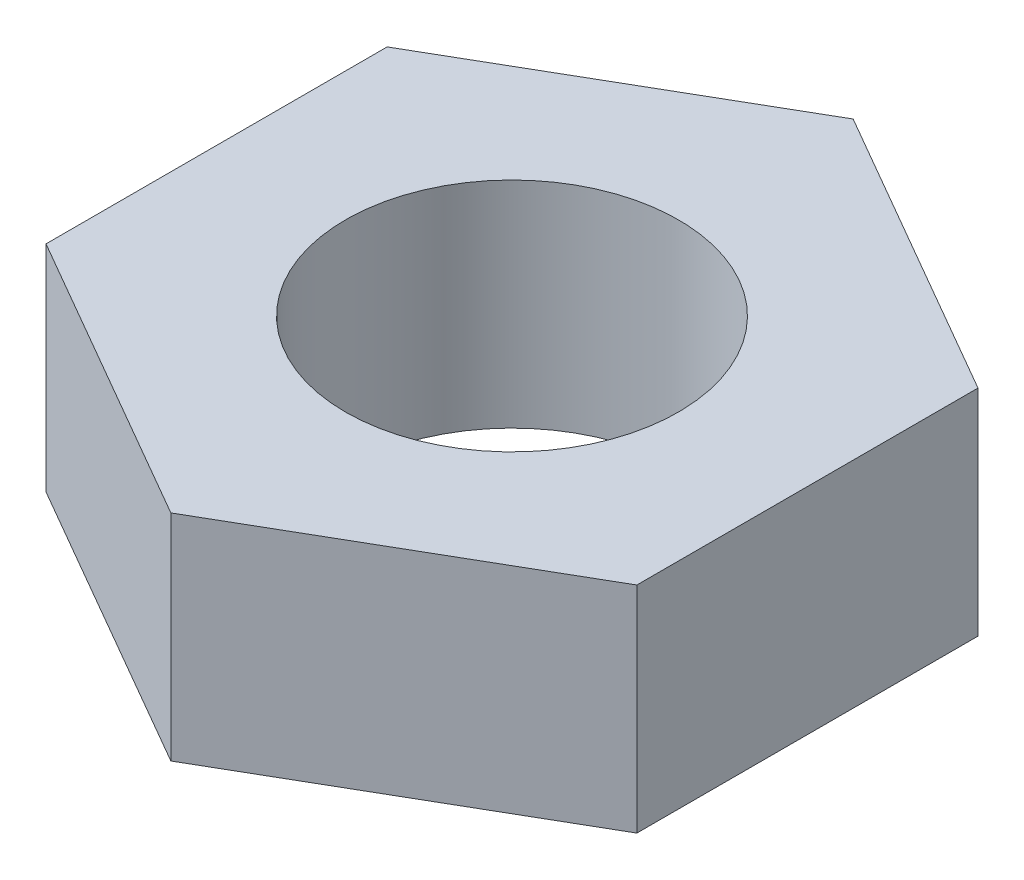
ISO-10303-21;
HEADER;
FILE_DESCRIPTION(('STEP AP214'),'2;1');
FILE_NAME('part.step','',(''),(''),'','','');
FILE_SCHEMA(('AUTOMOTIVE_DESIGN { 1 0 10303 214 1 1 1 1 }'));
ENDSEC;
DATA;
#1=APPLICATION_CONTEXT('core data for automotive mechanical design processes');
#2=APPLICATION_PROTOCOL_DEFINITION('international standard','automotive_design',2000,#1);
#3=PRODUCT_CONTEXT('',#1,'mechanical');
#4=PRODUCT('Part','Part','',(#3));
#5=PRODUCT_RELATED_PRODUCT_CATEGORY('part','',(#4));
#6=PRODUCT_DEFINITION_FORMATION('','',#4);
#7=PRODUCT_DEFINITION_CONTEXT('part definition',#1,'design');
#8=PRODUCT_DEFINITION('design','',#6,#7);
#9=PRODUCT_DEFINITION_SHAPE('','',#8);
#10=(LENGTH_UNIT() NAMED_UNIT(*) SI_UNIT(.MILLI.,.METRE.));
#11=(NAMED_UNIT(*) PLANE_ANGLE_UNIT() SI_UNIT($,.RADIAN.));
#12=(NAMED_UNIT(*) SI_UNIT($,.STERADIAN.) SOLID_ANGLE_UNIT());
#13=UNCERTAINTY_MEASURE_WITH_UNIT(LENGTH_MEASURE(1.E-05),#10,'distance_accuracy_value','');
#14=(GEOMETRIC_REPRESENTATION_CONTEXT(3) GLOBAL_UNCERTAINTY_ASSIGNED_CONTEXT((#13)) GLOBAL_UNIT_ASSIGNED_CONTEXT((#10,
#11,#12)) REPRESENTATION_CONTEXT('',''));
#15=CARTESIAN_POINT('',(0.,0.,0.));
#16=DIRECTION('',(0.,0.,1.));
#17=DIRECTION('',(1.,0.,0.));
#18=AXIS2_PLACEMENT_3D('',#15,#16,#17);
#19=CARTESIAN_POINT('',(0.,2.,0.));
#20=DIRECTION('',(0.,1.,0.));
#21=DIRECTION('',(0.,0.,1.));
#22=AXIS2_PLACEMENT_3D('',#19,#20,#21);
#23=PLANE('',#22);
#24=DIRECTION('',(-0.866025403784438,0.,-0.5));
#25=VECTOR('',#24,1.);
#26=CARTESIAN_POINT('',(2.75,2.,-1.58771324027147));
#27=LINE('',#26,#25);
#28=CARTESIAN_POINT('',(2.75,2.,-1.58771324027147));
#29=VERTEX_POINT('',#28);
#30=CARTESIAN_POINT('',(0.,2.,-3.17542648054294));
#31=VERTEX_POINT('',#30);
#32=EDGE_CURVE('E146',#29,#31,#27,.T.);
#33=ORIENTED_EDGE('',*,*,#32,.T.);
#34=DIRECTION('',(-0.866025403784438,0.,0.5));
#35=VECTOR('',#34,1.);
#36=CARTESIAN_POINT('',(0.,2.,-3.17542648054294));
#37=LINE('',#36,#35);
#38=CARTESIAN_POINT('',(-2.75,2.,-1.58771324027147));
#39=VERTEX_POINT('',#38);
#40=EDGE_CURVE('E94',#31,#39,#37,.T.);
#41=ORIENTED_EDGE('',*,*,#40,.T.);
#42=DIRECTION('',(0.,0.,1.));
#43=VECTOR('',#42,1.);
#44=CARTESIAN_POINT('',(-2.75,2.,-1.58771324027147));
#45=LINE('',#44,#43);
#46=CARTESIAN_POINT('',(-2.75,2.,1.58771324027147));
#47=VERTEX_POINT('',#46);
#48=EDGE_CURVE('E107',#39,#47,#45,.T.);
#49=ORIENTED_EDGE('',*,*,#48,.T.);
#50=DIRECTION('',(0.866025403784438,0.,0.5));
#51=VECTOR('',#50,1.);
#52=CARTESIAN_POINT('',(-2.75,2.,1.58771324027147));
#53=LINE('',#52,#51);
#54=CARTESIAN_POINT('',(0.,2.,3.17542648054294));
#55=VERTEX_POINT('',#54);
#56=EDGE_CURVE('E101',#47,#55,#53,.T.);
#57=ORIENTED_EDGE('',*,*,#56,.T.);
#58=DIRECTION('',(0.866025403784439,0.,-0.5));
#59=VECTOR('',#58,1.);
#60=CARTESIAN_POINT('',(0.,2.,3.17542648054294));
#61=LINE('',#60,#59);
#62=CARTESIAN_POINT('',(2.75,2.,1.58771324027147));
#63=VERTEX_POINT('',#62);
#64=EDGE_CURVE('E105',#55,#63,#61,.T.);
#65=ORIENTED_EDGE('',*,*,#64,.T.);
#66=DIRECTION('',(0.,0.,-1.));
#67=VECTOR('',#66,1.);
#68=CARTESIAN_POINT('',(2.75,2.,1.58771324027147));
#69=LINE('',#68,#67);
#70=EDGE_CURVE('E57',#63,#29,#69,.T.);
#71=ORIENTED_EDGE('',*,*,#70,.T.);
#72=EDGE_LOOP('',(#33,#41,#49,#57,#65,#71));
#73=FACE_BOUND('',#72,.T.);
#74=CARTESIAN_POINT('',(0.,2.,0.));
#75=DIRECTION('',(0.,1.,0.));
#76=DIRECTION('',(0.,0.,1.));
#77=AXIS2_PLACEMENT_3D('',#74,#75,#76);
#78=CIRCLE('',#77,1.55);
#79=CARTESIAN_POINT('',(0.,2.,1.55));
#80=VERTEX_POINT('',#79);
#81=EDGE_CURVE('E134',#80,#80,#78,.T.);
#82=ORIENTED_EDGE('',*,*,#81,.F.);
#83=EDGE_LOOP('',(#82));
#84=FACE_BOUND('',#83,.T.);
#85=ADVANCED_FACE('F39',(#73,#84),#23,.T.);
#86=CARTESIAN_POINT('',(0.,0.,0.));
#87=DIRECTION('',(0.,1.,0.));
#88=DIRECTION('',(0.,0.,1.));
#89=AXIS2_PLACEMENT_3D('',#86,#87,#88);
#90=PLANE('',#89);
#91=DIRECTION('',(-0.866025403784438,0.,-0.5));
#92=VECTOR('',#91,1.);
#93=CARTESIAN_POINT('',(2.75,0.,-1.58771324027147));
#94=LINE('',#93,#92);
#95=CARTESIAN_POINT('',(2.75,0.,-1.58771324027147));
#96=VERTEX_POINT('',#95);
#97=CARTESIAN_POINT('',(0.,0.,-3.17542648054294));
#98=VERTEX_POINT('',#97);
#99=EDGE_CURVE('E129',#96,#98,#94,.T.);
#100=ORIENTED_EDGE('',*,*,#99,.F.);
#101=DIRECTION('',(0.,0.,-1.));
#102=VECTOR('',#101,1.);
#103=CARTESIAN_POINT('',(2.75,0.,1.58771324027147));
#104=LINE('',#103,#102);
#105=CARTESIAN_POINT('',(2.75,0.,1.58771324027147));
#106=VERTEX_POINT('',#105);
#107=EDGE_CURVE('E86',#106,#96,#104,.T.);
#108=ORIENTED_EDGE('',*,*,#107,.F.);
#109=DIRECTION('',(0.866025403784439,0.,-0.5));
#110=VECTOR('',#109,1.);
#111=CARTESIAN_POINT('',(0.,0.,3.17542648054294));
#112=LINE('',#111,#110);
#113=CARTESIAN_POINT('',(0.,0.,3.17542648054294));
#114=VERTEX_POINT('',#113);
#115=EDGE_CURVE('E80',#114,#106,#112,.T.);
#116=ORIENTED_EDGE('',*,*,#115,.F.);
#117=DIRECTION('',(0.866025403784438,0.,0.5));
#118=VECTOR('',#117,1.);
#119=CARTESIAN_POINT('',(-2.75,0.,1.58771324027147));
#120=LINE('',#119,#118);
#121=CARTESIAN_POINT('',(-2.75,0.,1.58771324027147));
#122=VERTEX_POINT('',#121);
#123=EDGE_CURVE('E116',#122,#114,#120,.T.);
#124=ORIENTED_EDGE('',*,*,#123,.F.);
#125=DIRECTION('',(0.,0.,1.));
#126=VECTOR('',#125,1.);
#127=CARTESIAN_POINT('',(-2.75,0.,-1.58771324027147));
#128=LINE('',#127,#126);
#129=CARTESIAN_POINT('',(-2.75,0.,-1.58771324027147));
#130=VERTEX_POINT('',#129);
#131=EDGE_CURVE('E137',#130,#122,#128,.T.);
#132=ORIENTED_EDGE('',*,*,#131,.F.);
#133=DIRECTION('',(-0.866025403784438,0.,0.5));
#134=VECTOR('',#133,1.);
#135=CARTESIAN_POINT('',(0.,0.,-3.17542648054294));
#136=LINE('',#135,#134);
#137=EDGE_CURVE('E133',#98,#130,#136,.T.);
#138=ORIENTED_EDGE('',*,*,#137,.F.);
#139=EDGE_LOOP('',(#100,#108,#116,#124,#132,#138));
#140=FACE_BOUND('',#139,.T.);
#141=CARTESIAN_POINT('',(0.,0.,0.));
#142=DIRECTION('',(0.,1.,0.));
#143=DIRECTION('',(0.,0.,1.));
#144=AXIS2_PLACEMENT_3D('',#141,#142,#143);
#145=CIRCLE('',#144,1.55);
#146=CARTESIAN_POINT('',(0.,0.,1.55));
#147=VERTEX_POINT('',#146);
#148=EDGE_CURVE('E243',#147,#147,#145,.T.);
#149=ORIENTED_EDGE('',*,*,#148,.T.);
#150=EDGE_LOOP('',(#149));
#151=FACE_BOUND('',#150,.T.);
#152=ADVANCED_FACE('F159',(#140,#151),#90,.F.);
#153=CARTESIAN_POINT('',(2.75,2.,-1.58771324027147));
#154=DIRECTION('',(-0.5,0.,0.866025403784439));
#155=DIRECTION('',(0.866025403784438,0.,0.5));
#156=AXIS2_PLACEMENT_3D('',#153,#154,#155);
#157=PLANE('',#156);
#158=ORIENTED_EDGE('',*,*,#99,.T.);
#159=DIRECTION('',(0.,-1.,0.));
#160=VECTOR('',#159,1.);
#161=CARTESIAN_POINT('',(0.,2.,-3.17542648054294));
#162=LINE('',#161,#160);
#163=EDGE_CURVE('E11',#31,#98,#162,.T.);
#164=ORIENTED_EDGE('',*,*,#163,.F.);
#165=ORIENTED_EDGE('',*,*,#32,.F.);
#166=DIRECTION('',(0.,-1.,0.));
#167=VECTOR('',#166,1.);
#168=CARTESIAN_POINT('',(2.75,2.,-1.58771324027147));
#169=LINE('',#168,#167);
#170=EDGE_CURVE('E125',#29,#96,#169,.T.);
#171=ORIENTED_EDGE('',*,*,#170,.T.);
#172=EDGE_LOOP('',(#158,#164,#165,#171));
#173=FACE_BOUND('',#172,.T.);
#174=ADVANCED_FACE('F41',(#173),#157,.F.);
#175=CARTESIAN_POINT('',(0.,2.,-3.17542648054294));
#176=DIRECTION('',(0.5,0.,0.866025403784439));
#177=DIRECTION('',(0.866025403784439,0.,-0.5));
#178=AXIS2_PLACEMENT_3D('',#175,#176,#177);
#179=PLANE('',#178);
#180=ORIENTED_EDGE('',*,*,#137,.T.);
#181=DIRECTION('',(0.,-1.,0.));
#182=VECTOR('',#181,1.);
#183=CARTESIAN_POINT('',(-2.75,2.,-1.58771324027147));
#184=LINE('',#183,#182);
#185=EDGE_CURVE('E49',#39,#130,#184,.T.);
#186=ORIENTED_EDGE('',*,*,#185,.F.);
#187=ORIENTED_EDGE('',*,*,#40,.F.);
#188=ORIENTED_EDGE('',*,*,#163,.T.);
#189=EDGE_LOOP('',(#180,#186,#187,#188));
#190=FACE_BOUND('',#189,.T.);
#191=ADVANCED_FACE('F184',(#190),#179,.F.);
#192=CARTESIAN_POINT('',(-2.75,2.,-1.58771324027147));
#193=DIRECTION('',(1.,0.,0.));
#194=DIRECTION('',(0.,0.,-1.));
#195=AXIS2_PLACEMENT_3D('',#192,#193,#194);
#196=PLANE('',#195);
#197=ORIENTED_EDGE('',*,*,#131,.T.);
#198=DIRECTION('',(0.,-1.,0.));
#199=VECTOR('',#198,1.);
#200=CARTESIAN_POINT('',(-2.75,2.,1.58771324027147));
#201=LINE('',#200,#199);
#202=EDGE_CURVE('E118',#47,#122,#201,.T.);
#203=ORIENTED_EDGE('',*,*,#202,.F.);
#204=ORIENTED_EDGE('',*,*,#48,.F.);
#205=ORIENTED_EDGE('',*,*,#185,.T.);
#206=EDGE_LOOP('',(#197,#203,#204,#205));
#207=FACE_BOUND('',#206,.T.);
#208=ADVANCED_FACE('F156',(#207),#196,.F.);
#209=CARTESIAN_POINT('',(-2.75,2.,1.58771324027147));
#210=DIRECTION('',(0.5,0.,-0.866025403784439));
#211=DIRECTION('',(-0.866025403784438,0.,-0.5));
#212=AXIS2_PLACEMENT_3D('',#209,#210,#211);
#213=PLANE('',#212);
#214=ORIENTED_EDGE('',*,*,#123,.T.);
#215=DIRECTION('',(0.,-1.,0.));
#216=VECTOR('',#215,1.);
#217=CARTESIAN_POINT('',(0.,2.,3.17542648054294));
#218=LINE('',#217,#216);
#219=EDGE_CURVE('E113',#55,#114,#218,.T.);
#220=ORIENTED_EDGE('',*,*,#219,.F.);
#221=ORIENTED_EDGE('',*,*,#56,.F.);
#222=ORIENTED_EDGE('',*,*,#202,.T.);
#223=EDGE_LOOP('',(#214,#220,#221,#222));
#224=FACE_BOUND('',#223,.T.);
#225=ADVANCED_FACE('F114',(#224),#213,.F.);
#226=CARTESIAN_POINT('',(0.,2.,3.17542648054294));
#227=DIRECTION('',(-0.5,0.,-0.866025403784439));
#228=DIRECTION('',(-0.866025403784439,0.,0.5));
#229=AXIS2_PLACEMENT_3D('',#226,#227,#228);
#230=PLANE('',#229);
#231=ORIENTED_EDGE('',*,*,#115,.T.);
#232=DIRECTION('',(0.,-1.,0.));
#233=VECTOR('',#232,1.);
#234=CARTESIAN_POINT('',(2.75,2.,1.58771324027147));
#235=LINE('',#234,#233);
#236=EDGE_CURVE('E119',#63,#106,#235,.T.);
#237=ORIENTED_EDGE('',*,*,#236,.F.);
#238=ORIENTED_EDGE('',*,*,#64,.F.);
#239=ORIENTED_EDGE('',*,*,#219,.T.);
#240=EDGE_LOOP('',(#231,#237,#238,#239));
#241=FACE_BOUND('',#240,.T.);
#242=ADVANCED_FACE('F121',(#241),#230,.F.);
#243=CARTESIAN_POINT('',(2.75,2.,1.58771324027147));
#244=DIRECTION('',(-1.,0.,0.));
#245=DIRECTION('',(0.,0.,1.));
#246=AXIS2_PLACEMENT_3D('',#243,#244,#245);
#247=PLANE('',#246);
#248=ORIENTED_EDGE('',*,*,#107,.T.);
#249=ORIENTED_EDGE('',*,*,#170,.F.);
#250=ORIENTED_EDGE('',*,*,#70,.F.);
#251=ORIENTED_EDGE('',*,*,#236,.T.);
#252=EDGE_LOOP('',(#248,#249,#250,#251));
#253=FACE_BOUND('',#252,.T.);
#254=ADVANCED_FACE('F164',(#253),#247,.F.);
#255=CARTESIAN_POINT('',(0.,2.,0.));
#256=DIRECTION('',(0.,-1.,0.));
#257=DIRECTION('',(0.,0.,-1.));
#258=AXIS2_PLACEMENT_3D('',#255,#256,#257);
#259=CYLINDRICAL_SURFACE('',#258,1.55);
#260=ORIENTED_EDGE('',*,*,#81,.T.);
#261=EDGE_LOOP('',(#260));
#262=FACE_BOUND('',#261,.T.);
#263=ORIENTED_EDGE('',*,*,#148,.F.);
#264=EDGE_LOOP('',(#263));
#265=FACE_BOUND('',#264,.T.);
#266=ADVANCED_FACE('F166',(#262,#265),#259,.F.);
#267=CLOSED_SHELL('',(#85,#152,#174,#191,#208,#225,#242,#254,#266));
#268=MANIFOLD_SOLID_BREP('B2',#267);
#269=ADVANCED_BREP_SHAPE_REPRESENTATION('',(#18,#268),#14);
#270=SHAPE_DEFINITION_REPRESENTATION(#9,#269);
ENDSEC;
END-ISO-10303-21;
